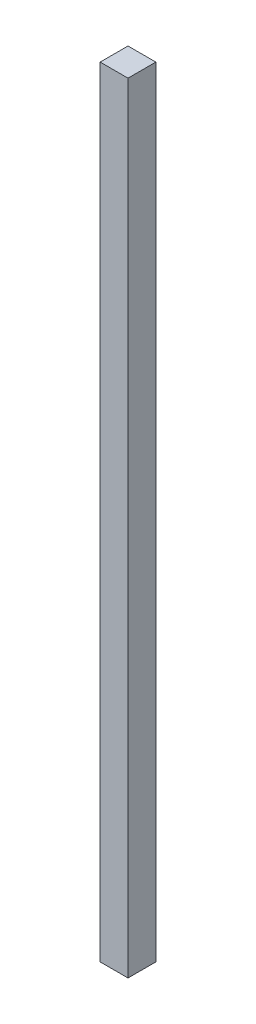
ISO-10303-21;
HEADER;
FILE_DESCRIPTION(('STEP AP214'),'2;1');
FILE_NAME('part.step','',(''),(''),'','','');
FILE_SCHEMA(('AUTOMOTIVE_DESIGN { 1 0 10303 214 1 1 1 1 }'));
ENDSEC;
DATA;
#1=APPLICATION_CONTEXT('core data for automotive mechanical design processes');
#2=APPLICATION_PROTOCOL_DEFINITION('international standard','automotive_design',2000,#1);
#3=PRODUCT_CONTEXT('',#1,'mechanical');
#4=PRODUCT('Part','Part','',(#3));
#5=PRODUCT_RELATED_PRODUCT_CATEGORY('part','',(#4));
#6=PRODUCT_DEFINITION_FORMATION('','',#4);
#7=PRODUCT_DEFINITION_CONTEXT('part definition',#1,'design');
#8=PRODUCT_DEFINITION('design','',#6,#7);
#9=PRODUCT_DEFINITION_SHAPE('','',#8);
#10=(LENGTH_UNIT() NAMED_UNIT(*) SI_UNIT(.MILLI.,.METRE.));
#11=(NAMED_UNIT(*) PLANE_ANGLE_UNIT() SI_UNIT($,.RADIAN.));
#12=(NAMED_UNIT(*) SI_UNIT($,.STERADIAN.) SOLID_ANGLE_UNIT());
#13=UNCERTAINTY_MEASURE_WITH_UNIT(LENGTH_MEASURE(1.E-05),#10,'distance_accuracy_value','');
#14=(GEOMETRIC_REPRESENTATION_CONTEXT(3) GLOBAL_UNCERTAINTY_ASSIGNED_CONTEXT((#13)) GLOBAL_UNIT_ASSIGNED_CONTEXT((#10,
#11,#12)) REPRESENTATION_CONTEXT('',''));
#15=CARTESIAN_POINT('',(0.,0.,0.));
#16=DIRECTION('',(0.,0.,1.));
#17=DIRECTION('',(1.,0.,0.));
#18=AXIS2_PLACEMENT_3D('',#15,#16,#17);
#19=CARTESIAN_POINT('',(5.,280.,5.));
#20=DIRECTION('',(-1.,0.,0.));
#21=DIRECTION('',(0.,0.,1.));
#22=AXIS2_PLACEMENT_3D('',#19,#20,#21);
#23=PLANE('',#22);
#24=DIRECTION('',(0.,0.,-1.));
#25=VECTOR('',#24,1.);
#26=CARTESIAN_POINT('',(5.,0.,5.));
#27=LINE('',#26,#25);
#28=CARTESIAN_POINT('',(5.,0.,5.));
#29=VERTEX_POINT('',#28);
#30=CARTESIAN_POINT('',(5.,0.,-5.));
#31=VERTEX_POINT('',#30);
#32=EDGE_CURVE('E107',#29,#31,#27,.T.);
#33=ORIENTED_EDGE('',*,*,#32,.T.);
#34=DIRECTION('',(0.,-1.,0.));
#35=VECTOR('',#34,1.);
#36=CARTESIAN_POINT('',(5.,280.,-5.));
#37=LINE('',#36,#35);
#38=CARTESIAN_POINT('',(5.,280.,-5.));
#39=VERTEX_POINT('',#38);
#40=EDGE_CURVE('E11',#39,#31,#37,.T.);
#41=ORIENTED_EDGE('',*,*,#40,.F.);
#42=DIRECTION('',(0.,0.,-1.));
#43=VECTOR('',#42,1.);
#44=CARTESIAN_POINT('',(5.,280.,5.));
#45=LINE('',#44,#43);
#46=CARTESIAN_POINT('',(5.,280.,5.));
#47=VERTEX_POINT('',#46);
#48=EDGE_CURVE('E91',#47,#39,#45,.T.);
#49=ORIENTED_EDGE('',*,*,#48,.F.);
#50=DIRECTION('',(0.,-1.,0.));
#51=VECTOR('',#50,1.);
#52=CARTESIAN_POINT('',(5.,280.,5.));
#53=LINE('',#52,#51);
#54=EDGE_CURVE('E103',#47,#29,#53,.T.);
#55=ORIENTED_EDGE('',*,*,#54,.T.);
#56=EDGE_LOOP('',(#33,#41,#49,#55));
#57=FACE_BOUND('',#56,.T.);
#58=ADVANCED_FACE('F39',(#57),#23,.F.);
#59=CARTESIAN_POINT('',(-5.,280.,-5.));
#60=DIRECTION('',(0.,0.,1.));
#61=DIRECTION('',(1.,0.,0.));
#62=AXIS2_PLACEMENT_3D('',#59,#60,#61);
#63=PLANE('',#62);
#64=DIRECTION('',(-1.,0.,0.));
#65=VECTOR('',#64,1.);
#66=CARTESIAN_POINT('',(-5.,0.,-5.));
#67=LINE('',#66,#65);
#68=CARTESIAN_POINT('',(-5.,0.,-5.));
#69=VERTEX_POINT('',#68);
#70=EDGE_CURVE('E96',#31,#69,#67,.T.);
#71=ORIENTED_EDGE('',*,*,#70,.T.);
#72=DIRECTION('',(0.,-1.,0.));
#73=VECTOR('',#72,1.);
#74=CARTESIAN_POINT('',(-5.,280.,-5.));
#75=LINE('',#74,#73);
#76=CARTESIAN_POINT('',(-5.,280.,-5.));
#77=VERTEX_POINT('',#76);
#78=EDGE_CURVE('E48',#77,#69,#75,.T.);
#79=ORIENTED_EDGE('',*,*,#78,.F.);
#80=DIRECTION('',(-1.,0.,0.));
#81=VECTOR('',#80,1.);
#82=CARTESIAN_POINT('',(-5.,280.,-5.));
#83=LINE('',#82,#81);
#84=EDGE_CURVE('E86',#39,#77,#83,.T.);
#85=ORIENTED_EDGE('',*,*,#84,.F.);
#86=ORIENTED_EDGE('',*,*,#40,.T.);
#87=EDGE_LOOP('',(#71,#79,#85,#86));
#88=FACE_BOUND('',#87,.T.);
#89=ADVANCED_FACE('F95',(#88),#63,.F.);
#90=CARTESIAN_POINT('',(-5.,280.,5.));
#91=DIRECTION('',(1.,0.,0.));
#92=DIRECTION('',(0.,0.,-1.));
#93=AXIS2_PLACEMENT_3D('',#90,#91,#92);
#94=PLANE('',#93);
#95=DIRECTION('',(0.,0.,1.));
#96=VECTOR('',#95,1.);
#97=CARTESIAN_POINT('',(-5.,0.,5.));
#98=LINE('',#97,#96);
#99=CARTESIAN_POINT('',(-5.,0.,5.));
#100=VERTEX_POINT('',#99);
#101=EDGE_CURVE('E73',#69,#100,#98,.T.);
#102=ORIENTED_EDGE('',*,*,#101,.T.);
#103=DIRECTION('',(0.,-1.,0.));
#104=VECTOR('',#103,1.);
#105=CARTESIAN_POINT('',(-5.,280.,5.));
#106=LINE('',#105,#104);
#107=CARTESIAN_POINT('',(-5.,280.,5.));
#108=VERTEX_POINT('',#107);
#109=EDGE_CURVE('E98',#108,#100,#106,.T.);
#110=ORIENTED_EDGE('',*,*,#109,.F.);
#111=DIRECTION('',(0.,0.,1.));
#112=VECTOR('',#111,1.);
#113=CARTESIAN_POINT('',(-5.,280.,5.));
#114=LINE('',#113,#112);
#115=EDGE_CURVE('E89',#77,#108,#114,.T.);
#116=ORIENTED_EDGE('',*,*,#115,.F.);
#117=ORIENTED_EDGE('',*,*,#78,.T.);
#118=EDGE_LOOP('',(#102,#110,#116,#117));
#119=FACE_BOUND('',#118,.T.);
#120=ADVANCED_FACE('F99',(#119),#94,.F.);
#121=CARTESIAN_POINT('',(-5.,280.,5.));
#122=DIRECTION('',(0.,0.,-1.));
#123=DIRECTION('',(-1.,0.,0.));
#124=AXIS2_PLACEMENT_3D('',#121,#122,#123);
#125=PLANE('',#124);
#126=DIRECTION('',(1.,0.,0.));
#127=VECTOR('',#126,1.);
#128=CARTESIAN_POINT('',(-5.,0.,5.));
#129=LINE('',#128,#127);
#130=EDGE_CURVE('E79',#100,#29,#129,.T.);
#131=ORIENTED_EDGE('',*,*,#130,.T.);
#132=ORIENTED_EDGE('',*,*,#54,.F.);
#133=DIRECTION('',(1.,0.,0.));
#134=VECTOR('',#133,1.);
#135=CARTESIAN_POINT('',(-5.,280.,5.));
#136=LINE('',#135,#134);
#137=EDGE_CURVE('E56',#108,#47,#136,.T.);
#138=ORIENTED_EDGE('',*,*,#137,.F.);
#139=ORIENTED_EDGE('',*,*,#109,.T.);
#140=EDGE_LOOP('',(#131,#132,#138,#139));
#141=FACE_BOUND('',#140,.T.);
#142=ADVANCED_FACE('F120',(#141),#125,.F.);
#143=CARTESIAN_POINT('',(0.,280.,0.));
#144=DIRECTION('',(0.,-1.,0.));
#145=DIRECTION('',(0.,0.,-1.));
#146=AXIS2_PLACEMENT_3D('',#143,#144,#145);
#147=PLANE('',#146);
#148=ORIENTED_EDGE('',*,*,#48,.T.);
#149=ORIENTED_EDGE('',*,*,#84,.T.);
#150=ORIENTED_EDGE('',*,*,#115,.T.);
#151=ORIENTED_EDGE('',*,*,#137,.T.);
#152=EDGE_LOOP('',(#148,#149,#150,#151));
#153=FACE_BOUND('',#152,.T.);
#154=ADVANCED_FACE('F87',(#153),#147,.F.);
#155=CARTESIAN_POINT('',(0.,0.,0.));
#156=DIRECTION('',(0.,-1.,0.));
#157=DIRECTION('',(0.,0.,-1.));
#158=AXIS2_PLACEMENT_3D('',#155,#156,#157);
#159=PLANE('',#158);
#160=ORIENTED_EDGE('',*,*,#32,.F.);
#161=ORIENTED_EDGE('',*,*,#130,.F.);
#162=ORIENTED_EDGE('',*,*,#101,.F.);
#163=ORIENTED_EDGE('',*,*,#70,.F.);
#164=EDGE_LOOP('',(#160,#161,#162,#163));
#165=FACE_BOUND('',#164,.T.);
#166=ADVANCED_FACE('F123',(#165),#159,.T.);
#167=CLOSED_SHELL('',(#58,#89,#120,#142,#154,#166));
#168=MANIFOLD_SOLID_BREP('B2',#167);
#169=ADVANCED_BREP_SHAPE_REPRESENTATION('',(#18,#168),#14);
#170=SHAPE_DEFINITION_REPRESENTATION(#9,#169);
ENDSEC;
END-ISO-10303-21;
